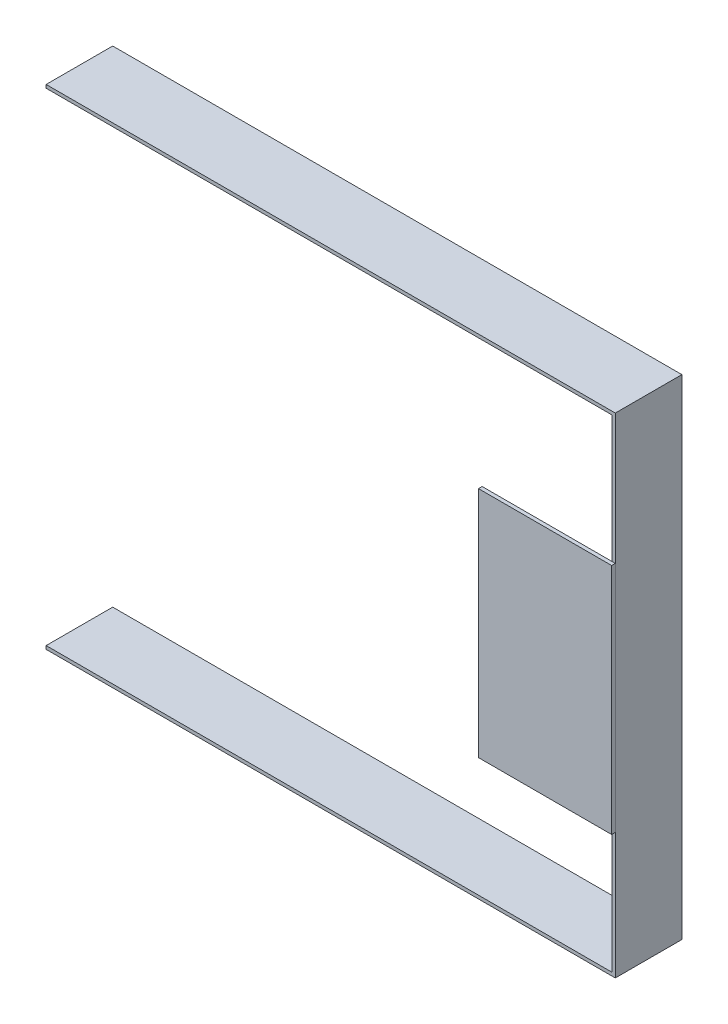
ISO-10303-21;
HEADER;
FILE_DESCRIPTION(('STEP AP214'),'2;1');
FILE_NAME('part.step','',(''),(''),'','','');
FILE_SCHEMA(('AUTOMOTIVE_DESIGN { 1 0 10303 214 1 1 1 1 }'));
ENDSEC;
DATA;
#1=APPLICATION_CONTEXT('core data for automotive mechanical design processes');
#2=APPLICATION_PROTOCOL_DEFINITION('international standard','automotive_design',2000,#1);
#3=PRODUCT_CONTEXT('',#1,'mechanical');
#4=PRODUCT('Part','Part','',(#3));
#5=PRODUCT_RELATED_PRODUCT_CATEGORY('part','',(#4));
#6=PRODUCT_DEFINITION_FORMATION('','',#4);
#7=PRODUCT_DEFINITION_CONTEXT('part definition',#1,'design');
#8=PRODUCT_DEFINITION('design','',#6,#7);
#9=PRODUCT_DEFINITION_SHAPE('','',#8);
#10=(LENGTH_UNIT() NAMED_UNIT(*) SI_UNIT(.MILLI.,.METRE.));
#11=(NAMED_UNIT(*) PLANE_ANGLE_UNIT() SI_UNIT($,.RADIAN.));
#12=(NAMED_UNIT(*) SI_UNIT($,.STERADIAN.) SOLID_ANGLE_UNIT());
#13=UNCERTAINTY_MEASURE_WITH_UNIT(LENGTH_MEASURE(1.E-05),#10,'distance_accuracy_value','');
#14=(GEOMETRIC_REPRESENTATION_CONTEXT(3) GLOBAL_UNCERTAINTY_ASSIGNED_CONTEXT((#13)) GLOBAL_UNIT_ASSIGNED_CONTEXT((#10,
#11,#12)) REPRESENTATION_CONTEXT('',''));
#15=CARTESIAN_POINT('',(0.,0.,0.));
#16=DIRECTION('',(0.,0.,1.));
#17=DIRECTION('',(1.,0.,0.));
#18=AXIS2_PLACEMENT_3D('',#15,#16,#17);
#19=CARTESIAN_POINT('',(151.09690865079,-54.5984493879628,50.8));
#20=DIRECTION('',(0.,0.,-1.));
#21=DIRECTION('',(-1.,0.,0.));
#22=AXIS2_PLACEMENT_3D('',#19,#20,#21);
#23=PLANE('',#22);
#24=DIRECTION('',(0.,1.,0.));
#25=VECTOR('',#24,1.);
#26=CARTESIAN_POINT('',(252.69690865079,-54.5984493879628,50.8));
#27=LINE('',#26,#25);
#28=CARTESIAN_POINT('',(252.69690865079,-232.398449387963,50.8));
#29=VERTEX_POINT('',#28);
#30=CARTESIAN_POINT('',(252.69690865079,-54.5984493879628,50.8));
#31=VERTEX_POINT('',#30);
#32=EDGE_CURVE('E107',#29,#31,#27,.T.);
#33=ORIENTED_EDGE('',*,*,#32,.F.);
#34=DIRECTION('',(1.,0.,0.));
#35=VECTOR('',#34,1.);
#36=CARTESIAN_POINT('',(151.09690865079,-232.398449387963,50.8));
#37=LINE('',#36,#35);
#38=CARTESIAN_POINT('',(151.09690865079,-232.398449387963,50.8));
#39=VERTEX_POINT('',#38);
#40=EDGE_CURVE('E12',#39,#29,#37,.T.);
#41=ORIENTED_EDGE('',*,*,#40,.F.);
#42=DIRECTION('',(0.,1.,0.));
#43=VECTOR('',#42,1.);
#44=CARTESIAN_POINT('',(151.09690865079,-54.5984493879628,50.8));
#45=LINE('',#44,#43);
#46=CARTESIAN_POINT('',(151.09690865079,-54.5984493879628,50.8));
#47=VERTEX_POINT('',#46);
#48=EDGE_CURVE('E101',#39,#47,#45,.T.);
#49=ORIENTED_EDGE('',*,*,#48,.T.);
#50=DIRECTION('',(1.,0.,0.));
#51=VECTOR('',#50,1.);
#52=CARTESIAN_POINT('',(151.09690865079,-54.5984493879628,50.8));
#53=LINE('',#52,#51);
#54=EDGE_CURVE('E46',#47,#31,#53,.T.);
#55=ORIENTED_EDGE('',*,*,#54,.T.);
#56=EDGE_LOOP('',(#33,#41,#49,#55));
#57=FACE_BOUND('',#56,.T.);
#58=ADVANCED_FACE('F43',(#57),#23,.T.);
#59=CARTESIAN_POINT('',(151.09690865079,-232.398449387963,50.8));
#60=DIRECTION('',(0.,-1.,0.));
#61=DIRECTION('',(0.,0.,-1.));
#62=AXIS2_PLACEMENT_3D('',#59,#60,#61);
#63=PLANE('',#62);
#64=DIRECTION('',(0.,0.,-1.));
#65=VECTOR('',#64,1.);
#66=CARTESIAN_POINT('',(252.69690865079,-232.398449387963,50.8));
#67=LINE('',#66,#65);
#68=CARTESIAN_POINT('',(252.69690865079,-232.398449387963,53.594));
#69=VERTEX_POINT('',#68);
#70=EDGE_CURVE('E103',#69,#29,#67,.T.);
#71=ORIENTED_EDGE('',*,*,#70,.F.);
#72=DIRECTION('',(1.,0.,0.));
#73=VECTOR('',#72,1.);
#74=CARTESIAN_POINT('',(151.09690865079,-232.398449387963,53.594));
#75=LINE('',#74,#73);
#76=CARTESIAN_POINT('',(151.09690865079,-232.398449387963,53.594));
#77=VERTEX_POINT('',#76);
#78=EDGE_CURVE('E52',#77,#69,#75,.T.);
#79=ORIENTED_EDGE('',*,*,#78,.F.);
#80=DIRECTION('',(0.,0.,-1.));
#81=VECTOR('',#80,1.);
#82=CARTESIAN_POINT('',(151.09690865079,-232.398449387963,50.8));
#83=LINE('',#82,#81);
#84=EDGE_CURVE('E98',#77,#39,#83,.T.);
#85=ORIENTED_EDGE('',*,*,#84,.T.);
#86=ORIENTED_EDGE('',*,*,#40,.T.);
#87=EDGE_LOOP('',(#71,#79,#85,#86));
#88=FACE_BOUND('',#87,.T.);
#89=ADVANCED_FACE('F117',(#88),#63,.T.);
#90=CARTESIAN_POINT('',(151.09690865079,-54.5984493879628,53.594));
#91=DIRECTION('',(0.,0.,1.));
#92=DIRECTION('',(0.,-1.,0.));
#93=AXIS2_PLACEMENT_3D('',#90,#91,#92);
#94=PLANE('',#93);
#95=DIRECTION('',(0.,-1.,0.));
#96=VECTOR('',#95,1.);
#97=CARTESIAN_POINT('',(252.69690865079,-54.5984493879628,53.594));
#98=LINE('',#97,#96);
#99=CARTESIAN_POINT('',(252.69690865079,-54.5984493879628,53.594));
#100=VERTEX_POINT('',#99);
#101=EDGE_CURVE('E93',#100,#69,#98,.T.);
#102=ORIENTED_EDGE('',*,*,#101,.F.);
#103=DIRECTION('',(1.,0.,0.));
#104=VECTOR('',#103,1.);
#105=CARTESIAN_POINT('',(151.09690865079,-54.5984493879628,53.594));
#106=LINE('',#105,#104);
#107=CARTESIAN_POINT('',(151.09690865079,-54.5984493879628,53.594));
#108=VERTEX_POINT('',#107);
#109=EDGE_CURVE('E88',#108,#100,#106,.T.);
#110=ORIENTED_EDGE('',*,*,#109,.F.);
#111=DIRECTION('',(0.,-1.,0.));
#112=VECTOR('',#111,1.);
#113=CARTESIAN_POINT('',(151.09690865079,-54.5984493879628,53.594));
#114=LINE('',#113,#112);
#115=EDGE_CURVE('E91',#108,#77,#114,.T.);
#116=ORIENTED_EDGE('',*,*,#115,.T.);
#117=ORIENTED_EDGE('',*,*,#78,.T.);
#118=EDGE_LOOP('',(#102,#110,#116,#117));
#119=FACE_BOUND('',#118,.T.);
#120=ADVANCED_FACE('F90',(#119),#94,.T.);
#121=CARTESIAN_POINT('',(151.09690865079,-54.5984493879628,50.8));
#122=DIRECTION('',(0.,1.,0.));
#123=DIRECTION('',(0.,0.,1.));
#124=AXIS2_PLACEMENT_3D('',#121,#122,#123);
#125=PLANE('',#124);
#126=DIRECTION('',(0.,0.,1.));
#127=VECTOR('',#126,1.);
#128=CARTESIAN_POINT('',(252.69690865079,-54.5984493879628,50.8));
#129=LINE('',#128,#127);
#130=EDGE_CURVE('E110',#31,#100,#129,.T.);
#131=ORIENTED_EDGE('',*,*,#130,.F.);
#132=ORIENTED_EDGE('',*,*,#54,.F.);
#133=DIRECTION('',(0.,0.,1.));
#134=VECTOR('',#133,1.);
#135=CARTESIAN_POINT('',(151.09690865079,-54.5984493879628,50.8));
#136=LINE('',#135,#134);
#137=EDGE_CURVE('E97',#47,#108,#136,.T.);
#138=ORIENTED_EDGE('',*,*,#137,.T.);
#139=ORIENTED_EDGE('',*,*,#109,.T.);
#140=EDGE_LOOP('',(#131,#132,#138,#139));
#141=FACE_BOUND('',#140,.T.);
#142=ADVANCED_FACE('F100',(#141),#125,.T.);
#143=CARTESIAN_POINT('',(151.09690865079,0.,0.));
#144=DIRECTION('',(-1.,0.,0.));
#145=DIRECTION('',(0.,0.,1.));
#146=AXIS2_PLACEMENT_3D('',#143,#144,#145);
#147=PLANE('',#146);
#148=ORIENTED_EDGE('',*,*,#48,.F.);
#149=ORIENTED_EDGE('',*,*,#84,.F.);
#150=ORIENTED_EDGE('',*,*,#115,.F.);
#151=ORIENTED_EDGE('',*,*,#137,.F.);
#152=EDGE_LOOP('',(#148,#149,#150,#151));
#153=FACE_BOUND('',#152,.T.);
#154=ADVANCED_FACE('F96',(#153),#147,.T.);
#155=CARTESIAN_POINT('',(252.69690865079,0.,0.));
#156=DIRECTION('',(-1.,0.,0.));
#157=DIRECTION('',(0.,0.,1.));
#158=AXIS2_PLACEMENT_3D('',#155,#156,#157);
#159=PLANE('',#158);
#160=ORIENTED_EDGE('',*,*,#32,.T.);
#161=ORIENTED_EDGE('',*,*,#130,.T.);
#162=ORIENTED_EDGE('',*,*,#101,.T.);
#163=ORIENTED_EDGE('',*,*,#70,.T.);
#164=EDGE_LOOP('',(#160,#161,#162,#163));
#165=FACE_BOUND('',#164,.T.);
#166=ADVANCED_FACE('F116',(#165),#159,.F.);
#167=CLOSED_SHELL('',(#58,#89,#120,#142,#154,#166));
#168=MANIFOLD_SOLID_BREP('B2',#167);
#169=CARTESIAN_POINT('',(-181.64309134921,44.7592021951679,50.8));
#170=DIRECTION('',(1.,0.,0.));
#171=DIRECTION('',(0.,0.,-1.));
#172=AXIS2_PLACEMENT_3D('',#169,#170,#171);
#173=PLANE('',#172);
#174=DIRECTION('',(0.,-1.,0.));
#175=VECTOR('',#174,1.);
#176=CARTESIAN_POINT('',(-181.64309134921,44.7592021951679,0.));
#177=LINE('',#176,#175);
#178=CARTESIAN_POINT('',(-181.64309134921,44.7592021951679,0.));
#179=VERTEX_POINT('',#178);
#180=CARTESIAN_POINT('',(-181.64309134921,42.2192021951679,0.));
#181=VERTEX_POINT('',#180);
#182=EDGE_CURVE('E263',#179,#181,#177,.T.);
#183=ORIENTED_EDGE('',*,*,#182,.T.);
#184=DIRECTION('',(0.,0.,-1.));
#185=VECTOR('',#184,1.);
#186=CARTESIAN_POINT('',(-181.64309134921,42.2192021951679,50.8));
#187=LINE('',#186,#185);
#188=CARTESIAN_POINT('',(-181.64309134921,42.2192021951679,50.8));
#189=VERTEX_POINT('',#188);
#190=EDGE_CURVE('E41',#189,#181,#187,.T.);
#191=ORIENTED_EDGE('',*,*,#190,.F.);
#192=DIRECTION('',(0.,-1.,0.));
#193=VECTOR('',#192,1.);
#194=CARTESIAN_POINT('',(-181.64309134921,44.7592021951679,50.8));
#195=LINE('',#194,#193);
#196=CARTESIAN_POINT('',(-181.64309134921,44.7592021951679,50.8));
#197=VERTEX_POINT('',#196);
#198=EDGE_CURVE('E280',#197,#189,#195,.T.);
#199=ORIENTED_EDGE('',*,*,#198,.F.);
#200=DIRECTION('',(0.,0.,-1.));
#201=VECTOR('',#200,1.);
#202=CARTESIAN_POINT('',(-181.64309134921,44.7592021951679,50.8));
#203=LINE('',#202,#201);
#204=EDGE_CURVE('E183',#197,#179,#203,.T.);
#205=ORIENTED_EDGE('',*,*,#204,.T.);
#206=EDGE_LOOP('',(#183,#191,#199,#205));
#207=FACE_BOUND('',#206,.T.);
#208=ADVANCED_FACE('F167',(#207),#173,.F.);
#209=CARTESIAN_POINT('',(-181.64309134921,42.2192021951679,50.8));
#210=DIRECTION('',(0.,1.,0.));
#211=DIRECTION('',(0.,0.,1.));
#212=AXIS2_PLACEMENT_3D('',#209,#210,#211);
#213=PLANE('',#212);
#214=DIRECTION('',(1.,0.,0.));
#215=VECTOR('',#214,1.);
#216=CARTESIAN_POINT('',(-181.64309134921,42.2192021951679,0.));
#217=LINE('',#216,#215);
#218=CARTESIAN_POINT('',(250.15690865079,42.2192021951679,0.));
#219=VERTEX_POINT('',#218);
#220=EDGE_CURVE('E265',#181,#219,#217,.T.);
#221=ORIENTED_EDGE('',*,*,#220,.T.);
#222=DIRECTION('',(0.,0.,-1.));
#223=VECTOR('',#222,1.);
#224=CARTESIAN_POINT('',(250.15690865079,42.2192021951679,50.8));
#225=LINE('',#224,#223);
#226=CARTESIAN_POINT('',(250.15690865079,42.2192021951679,50.8));
#227=VERTEX_POINT('',#226);
#228=EDGE_CURVE('E175',#227,#219,#225,.T.);
#229=ORIENTED_EDGE('',*,*,#228,.F.);
#230=DIRECTION('',(1.,0.,0.));
#231=VECTOR('',#230,1.);
#232=CARTESIAN_POINT('',(-181.64309134921,42.2192021951679,50.8));
#233=LINE('',#232,#231);
#234=EDGE_CURVE('E221',#189,#227,#233,.T.);
#235=ORIENTED_EDGE('',*,*,#234,.F.);
#236=ORIENTED_EDGE('',*,*,#190,.T.);
#237=EDGE_LOOP('',(#221,#229,#235,#236));
#238=FACE_BOUND('',#237,.T.);
#239=ADVANCED_FACE('F312',(#238),#213,.F.);
#240=CARTESIAN_POINT('',(250.15690865079,42.2192021951679,50.8));
#241=DIRECTION('',(1.,0.,0.));
#242=DIRECTION('',(0.,1.,0.));
#243=AXIS2_PLACEMENT_3D('',#240,#241,#242);
#244=PLANE('',#243);
#245=DIRECTION('',(0.,-1.,0.));
#246=VECTOR('',#245,1.);
#247=CARTESIAN_POINT('',(250.15690865079,42.2192021951679,0.));
#248=LINE('',#247,#246);
#249=CARTESIAN_POINT('',(250.15690865079,-326.080797804832,0.));
#250=VERTEX_POINT('',#249);
#251=EDGE_CURVE('E267',#219,#250,#248,.T.);
#252=ORIENTED_EDGE('',*,*,#251,.T.);
#253=DIRECTION('',(0.,0.,-1.));
#254=VECTOR('',#253,1.);
#255=CARTESIAN_POINT('',(250.15690865079,-326.080797804832,50.8));
#256=LINE('',#255,#254);
#257=CARTESIAN_POINT('',(250.15690865079,-326.080797804832,50.8));
#258=VERTEX_POINT('',#257);
#259=EDGE_CURVE('E287',#258,#250,#256,.T.);
#260=ORIENTED_EDGE('',*,*,#259,.F.);
#261=DIRECTION('',(0.,-1.,0.));
#262=VECTOR('',#261,1.);
#263=CARTESIAN_POINT('',(250.15690865079,42.2192021951679,50.8));
#264=LINE('',#263,#262);
#265=EDGE_CURVE('E295',#227,#258,#264,.T.);
#266=ORIENTED_EDGE('',*,*,#265,.F.);
#267=ORIENTED_EDGE('',*,*,#228,.T.);
#268=EDGE_LOOP('',(#252,#260,#266,#267));
#269=FACE_BOUND('',#268,.T.);
#270=ADVANCED_FACE('F293',(#269),#244,.F.);
#271=CARTESIAN_POINT('',(250.15690865079,-326.080797804832,50.8));
#272=DIRECTION('',(0.,-1.,0.));
#273=DIRECTION('',(0.,0.,-1.));
#274=AXIS2_PLACEMENT_3D('',#271,#272,#273);
#275=PLANE('',#274);
#276=DIRECTION('',(-1.,0.,0.));
#277=VECTOR('',#276,1.);
#278=CARTESIAN_POINT('',(250.15690865079,-326.080797804832,0.));
#279=LINE('',#278,#277);
#280=CARTESIAN_POINT('',(-181.64309134921,-326.080797804832,0.));
#281=VERTEX_POINT('',#280);
#282=EDGE_CURVE('E269',#250,#281,#279,.T.);
#283=ORIENTED_EDGE('',*,*,#282,.T.);
#284=DIRECTION('',(0.,0.,-1.));
#285=VECTOR('',#284,1.);
#286=CARTESIAN_POINT('',(-181.64309134921,-326.080797804832,50.8));
#287=LINE('',#286,#285);
#288=CARTESIAN_POINT('',(-181.64309134921,-326.080797804832,50.8));
#289=VERTEX_POINT('',#288);
#290=EDGE_CURVE('E284',#289,#281,#287,.T.);
#291=ORIENTED_EDGE('',*,*,#290,.F.);
#292=DIRECTION('',(-1.,0.,0.));
#293=VECTOR('',#292,1.);
#294=CARTESIAN_POINT('',(250.15690865079,-326.080797804832,50.8));
#295=LINE('',#294,#293);
#296=EDGE_CURVE('E306',#258,#289,#295,.T.);
#297=ORIENTED_EDGE('',*,*,#296,.F.);
#298=ORIENTED_EDGE('',*,*,#259,.T.);
#299=EDGE_LOOP('',(#283,#291,#297,#298));
#300=FACE_BOUND('',#299,.T.);
#301=ADVANCED_FACE('F302',(#300),#275,.F.);
#302=CARTESIAN_POINT('',(-181.64309134921,-326.080797804832,50.8));
#303=DIRECTION('',(1.,0.,0.));
#304=DIRECTION('',(0.,1.,0.));
#305=AXIS2_PLACEMENT_3D('',#302,#303,#304);
#306=PLANE('',#305);
#307=DIRECTION('',(0.,-1.,0.));
#308=VECTOR('',#307,1.);
#309=CARTESIAN_POINT('',(-181.64309134921,-326.080797804832,0.));
#310=LINE('',#309,#308);
#311=CARTESIAN_POINT('',(-181.64309134921,-328.620797804832,0.));
#312=VERTEX_POINT('',#311);
#313=EDGE_CURVE('E271',#281,#312,#310,.T.);
#314=ORIENTED_EDGE('',*,*,#313,.T.);
#315=DIRECTION('',(0.,0.,-1.));
#316=VECTOR('',#315,1.);
#317=CARTESIAN_POINT('',(-181.64309134921,-328.620797804832,50.8));
#318=LINE('',#317,#316);
#319=CARTESIAN_POINT('',(-181.64309134921,-328.620797804832,50.8));
#320=VERTEX_POINT('',#319);
#321=EDGE_CURVE('E246',#320,#312,#318,.T.);
#322=ORIENTED_EDGE('',*,*,#321,.F.);
#323=DIRECTION('',(0.,-1.,0.));
#324=VECTOR('',#323,1.);
#325=CARTESIAN_POINT('',(-181.64309134921,-326.080797804832,50.8));
#326=LINE('',#325,#324);
#327=EDGE_CURVE('E254',#289,#320,#326,.T.);
#328=ORIENTED_EDGE('',*,*,#327,.F.);
#329=ORIENTED_EDGE('',*,*,#290,.T.);
#330=EDGE_LOOP('',(#314,#322,#328,#329));
#331=FACE_BOUND('',#330,.T.);
#332=ADVANCED_FACE('F305',(#331),#306,.F.);
#333=CARTESIAN_POINT('',(252.69690865079,-328.620797804832,50.8));
#334=DIRECTION('',(0.,-1.,0.));
#335=DIRECTION('',(0.,0.,-1.));
#336=AXIS2_PLACEMENT_3D('',#333,#334,#335);
#337=PLANE('',#336);
#338=DIRECTION('',(-1.,0.,0.));
#339=VECTOR('',#338,1.);
#340=CARTESIAN_POINT('',(252.69690865079,-328.620797804832,0.));
#341=LINE('',#340,#339);
#342=CARTESIAN_POINT('',(252.69690865079,-328.620797804832,0.));
#343=VERTEX_POINT('',#342);
#344=EDGE_CURVE('E242',#343,#312,#341,.T.);
#345=ORIENTED_EDGE('',*,*,#344,.F.);
#346=DIRECTION('',(0.,0.,-1.));
#347=VECTOR('',#346,1.);
#348=CARTESIAN_POINT('',(252.69690865079,-328.620797804832,50.8));
#349=LINE('',#348,#347);
#350=CARTESIAN_POINT('',(252.69690865079,-328.620797804832,50.8));
#351=VERTEX_POINT('',#350);
#352=EDGE_CURVE('E237',#351,#343,#349,.T.);
#353=ORIENTED_EDGE('',*,*,#352,.F.);
#354=DIRECTION('',(-1.,0.,0.));
#355=VECTOR('',#354,1.);
#356=CARTESIAN_POINT('',(252.69690865079,-328.620797804832,50.8));
#357=LINE('',#356,#355);
#358=EDGE_CURVE('E240',#351,#320,#357,.T.);
#359=ORIENTED_EDGE('',*,*,#358,.T.);
#360=ORIENTED_EDGE('',*,*,#321,.T.);
#361=EDGE_LOOP('',(#345,#353,#359,#360));
#362=FACE_BOUND('',#361,.T.);
#363=ADVANCED_FACE('F239',(#362),#337,.T.);
#364=CARTESIAN_POINT('',(252.69690865079,44.7592021951679,50.8));
#365=DIRECTION('',(1.,0.,0.));
#366=DIRECTION('',(0.,0.,-1.));
#367=AXIS2_PLACEMENT_3D('',#364,#365,#366);
#368=PLANE('',#367);
#369=DIRECTION('',(0.,-1.,0.));
#370=VECTOR('',#369,1.);
#371=CARTESIAN_POINT('',(252.69690865079,44.7592021951679,0.));
#372=LINE('',#371,#370);
#373=CARTESIAN_POINT('',(252.69690865079,44.7592021951679,0.));
#374=VERTEX_POINT('',#373);
#375=EDGE_CURVE('E275',#374,#343,#372,.T.);
#376=ORIENTED_EDGE('',*,*,#375,.F.);
#377=DIRECTION('',(0.,0.,-1.));
#378=VECTOR('',#377,1.);
#379=CARTESIAN_POINT('',(252.69690865079,44.7592021951679,50.8));
#380=LINE('',#379,#378);
#381=CARTESIAN_POINT('',(252.69690865079,44.7592021951679,50.8));
#382=VERTEX_POINT('',#381);
#383=EDGE_CURVE('E209',#382,#374,#380,.T.);
#384=ORIENTED_EDGE('',*,*,#383,.F.);
#385=DIRECTION('',(0.,-1.,0.));
#386=VECTOR('',#385,1.);
#387=CARTESIAN_POINT('',(252.69690865079,44.7592021951679,50.8));
#388=LINE('',#387,#386);
#389=EDGE_CURVE('E252',#382,#351,#388,.T.);
#390=ORIENTED_EDGE('',*,*,#389,.T.);
#391=ORIENTED_EDGE('',*,*,#352,.T.);
#392=EDGE_LOOP('',(#376,#384,#390,#391));
#393=FACE_BOUND('',#392,.T.);
#394=ADVANCED_FACE('F257',(#393),#368,.T.);
#395=CARTESIAN_POINT('',(-181.64309134921,44.7592021951679,50.8));
#396=DIRECTION('',(0.,1.,0.));
#397=DIRECTION('',(0.,0.,1.));
#398=AXIS2_PLACEMENT_3D('',#395,#396,#397);
#399=PLANE('',#398);
#400=DIRECTION('',(1.,0.,0.));
#401=VECTOR('',#400,1.);
#402=CARTESIAN_POINT('',(-181.64309134921,44.7592021951679,0.));
#403=LINE('',#402,#401);
#404=EDGE_CURVE('E277',#179,#374,#403,.T.);
#405=ORIENTED_EDGE('',*,*,#404,.F.);
#406=ORIENTED_EDGE('',*,*,#204,.F.);
#407=DIRECTION('',(1.,0.,0.));
#408=VECTOR('',#407,1.);
#409=CARTESIAN_POINT('',(-181.64309134921,44.7592021951679,50.8));
#410=LINE('',#409,#408);
#411=EDGE_CURVE('E258',#197,#382,#410,.T.);
#412=ORIENTED_EDGE('',*,*,#411,.T.);
#413=ORIENTED_EDGE('',*,*,#383,.T.);
#414=EDGE_LOOP('',(#405,#406,#412,#413));
#415=FACE_BOUND('',#414,.T.);
#416=ADVANCED_FACE('F328',(#415),#399,.T.);
#417=CARTESIAN_POINT('',(0.,0.,50.8));
#418=DIRECTION('',(0.,0.,1.));
#419=DIRECTION('',(1.,0.,0.));
#420=AXIS2_PLACEMENT_3D('',#417,#418,#419);
#421=PLANE('',#420);
#422=ORIENTED_EDGE('',*,*,#198,.T.);
#423=ORIENTED_EDGE('',*,*,#234,.T.);
#424=ORIENTED_EDGE('',*,*,#265,.T.);
#425=ORIENTED_EDGE('',*,*,#296,.T.);
#426=ORIENTED_EDGE('',*,*,#327,.T.);
#427=ORIENTED_EDGE('',*,*,#358,.F.);
#428=ORIENTED_EDGE('',*,*,#389,.F.);
#429=ORIENTED_EDGE('',*,*,#411,.F.);
#430=EDGE_LOOP('',(#422,#423,#424,#425,#426,#427,#428,#429));
#431=FACE_BOUND('',#430,.T.);
#432=ADVANCED_FACE('F250',(#431),#421,.T.);
#433=CARTESIAN_POINT('',(0.,0.,0.));
#434=DIRECTION('',(0.,0.,1.));
#435=DIRECTION('',(1.,0.,0.));
#436=AXIS2_PLACEMENT_3D('',#433,#434,#435);
#437=PLANE('',#436);
#438=ORIENTED_EDGE('',*,*,#182,.F.);
#439=ORIENTED_EDGE('',*,*,#404,.T.);
#440=ORIENTED_EDGE('',*,*,#375,.T.);
#441=ORIENTED_EDGE('',*,*,#344,.T.);
#442=ORIENTED_EDGE('',*,*,#313,.F.);
#443=ORIENTED_EDGE('',*,*,#282,.F.);
#444=ORIENTED_EDGE('',*,*,#251,.F.);
#445=ORIENTED_EDGE('',*,*,#220,.F.);
#446=EDGE_LOOP('',(#438,#439,#440,#441,#442,#443,#444,#445));
#447=FACE_BOUND('',#446,.T.);
#448=ADVANCED_FACE('F298',(#447),#437,.F.);
#449=CLOSED_SHELL('',(#208,#239,#270,#301,#332,#363,#394,#416,#432,#448));
#450=MANIFOLD_SOLID_BREP('B6',#449);
#451=ADVANCED_BREP_SHAPE_REPRESENTATION('',(#18,#168,#450),#14);
#452=SHAPE_DEFINITION_REPRESENTATION(#9,#451);
ENDSEC;
END-ISO-10303-21;
